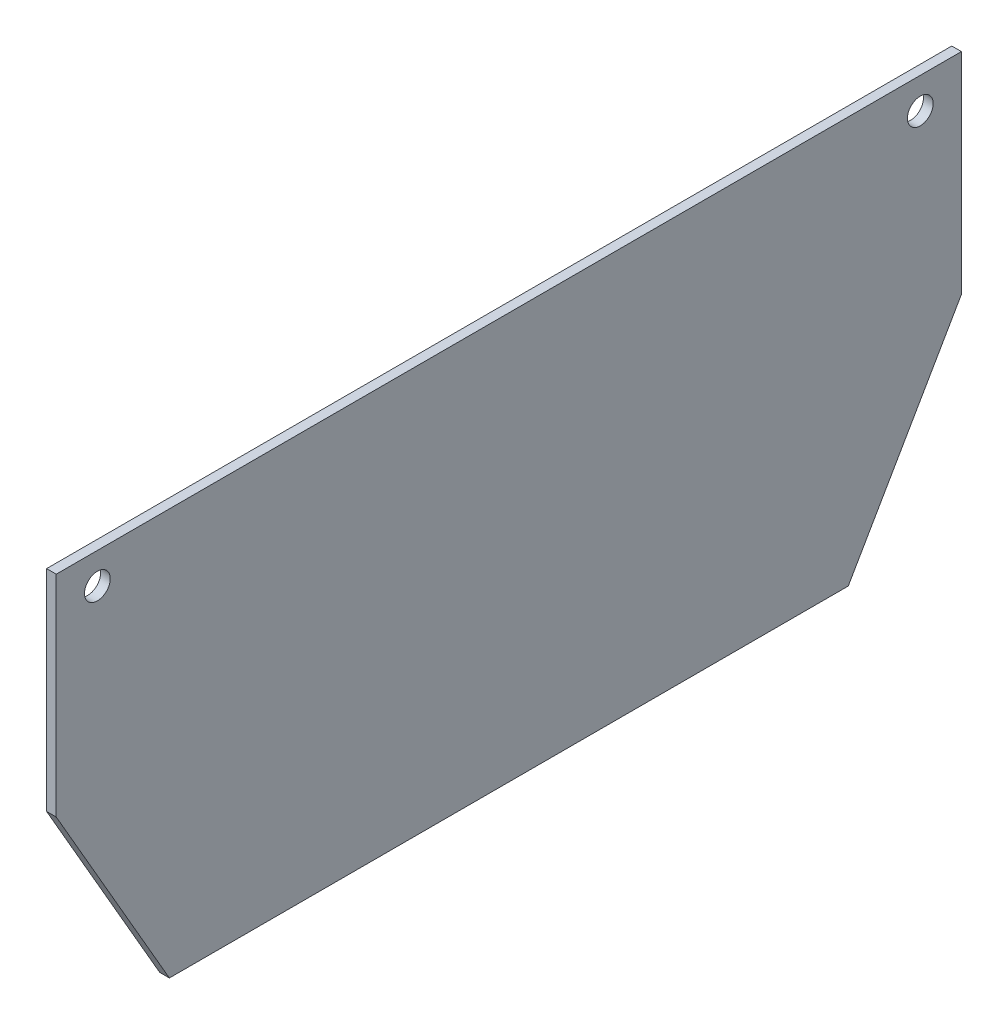
ISO-10303-21;
HEADER;
FILE_DESCRIPTION(('STEP AP214'),'2;1');
FILE_NAME('part.step','',(''),(''),'','','');
FILE_SCHEMA(('AUTOMOTIVE_DESIGN { 1 0 10303 214 1 1 1 1 }'));
ENDSEC;
DATA;
#1=APPLICATION_CONTEXT('core data for automotive mechanical design processes');
#2=APPLICATION_PROTOCOL_DEFINITION('international standard','automotive_design',2000,#1);
#3=PRODUCT_CONTEXT('',#1,'mechanical');
#4=PRODUCT('Part','Part','',(#3));
#5=PRODUCT_RELATED_PRODUCT_CATEGORY('part','',(#4));
#6=PRODUCT_DEFINITION_FORMATION('','',#4);
#7=PRODUCT_DEFINITION_CONTEXT('part definition',#1,'design');
#8=PRODUCT_DEFINITION('design','',#6,#7);
#9=PRODUCT_DEFINITION_SHAPE('','',#8);
#10=(LENGTH_UNIT() NAMED_UNIT(*) SI_UNIT(.MILLI.,.METRE.));
#11=(NAMED_UNIT(*) PLANE_ANGLE_UNIT() SI_UNIT($,.RADIAN.));
#12=(NAMED_UNIT(*) SI_UNIT($,.STERADIAN.) SOLID_ANGLE_UNIT());
#13=UNCERTAINTY_MEASURE_WITH_UNIT(LENGTH_MEASURE(1.E-05),#10,'distance_accuracy_value','');
#14=(GEOMETRIC_REPRESENTATION_CONTEXT(3) GLOBAL_UNCERTAINTY_ASSIGNED_CONTEXT((#13)) GLOBAL_UNIT_ASSIGNED_CONTEXT((#10,
#11,#12)) REPRESENTATION_CONTEXT('',''));
#15=CARTESIAN_POINT('',(0.,0.,0.));
#16=DIRECTION('',(0.,0.,1.));
#17=DIRECTION('',(1.,0.,0.));
#18=AXIS2_PLACEMENT_3D('',#15,#16,#17);
#19=CARTESIAN_POINT('',(11.90625,-250.825,-558.8));
#20=DIRECTION('',(0.,0.,1.));
#21=DIRECTION('',(1.,0.,0.));
#22=AXIS2_PLACEMENT_3D('',#19,#20,#21);
#23=PLANE('',#22);
#24=DIRECTION('',(0.,1.,0.));
#25=VECTOR('',#24,1.);
#26=CARTESIAN_POINT('',(11.90625,-250.825,-558.8));
#27=LINE('',#26,#25);
#28=CARTESIAN_POINT('',(11.90625,-8.85750218262826,-558.8));
#29=VERTEX_POINT('',#28);
#30=CARTESIAN_POINT('',(11.90625,250.825,-558.8));
#31=VERTEX_POINT('',#30);
#32=EDGE_CURVE('E98',#29,#31,#27,.T.);
#33=ORIENTED_EDGE('',*,*,#32,.F.);
#34=DIRECTION('',(-1.,0.,0.));
#35=VECTOR('',#34,1.);
#36=CARTESIAN_POINT('',(11.90625,-8.85750218262826,-558.8));
#37=LINE('',#36,#35);
#38=CARTESIAN_POINT('',(0.,-8.85750218262826,-558.8));
#39=VERTEX_POINT('',#38);
#40=EDGE_CURVE('E11',#29,#39,#37,.T.);
#41=ORIENTED_EDGE('',*,*,#40,.T.);
#42=DIRECTION('',(0.,1.,0.));
#43=VECTOR('',#42,1.);
#44=CARTESIAN_POINT('',(0.,-250.825,-558.8));
#45=LINE('',#44,#43);
#46=CARTESIAN_POINT('',(0.,250.825,-558.8));
#47=VERTEX_POINT('',#46);
#48=EDGE_CURVE('E119',#39,#47,#45,.T.);
#49=ORIENTED_EDGE('',*,*,#48,.T.);
#50=DIRECTION('',(-1.,0.,0.));
#51=VECTOR('',#50,1.);
#52=CARTESIAN_POINT('',(11.90625,250.825,-558.8));
#53=LINE('',#52,#51);
#54=EDGE_CURVE('E112',#31,#47,#53,.T.);
#55=ORIENTED_EDGE('',*,*,#54,.F.);
#56=EDGE_LOOP('',(#33,#41,#49,#55));
#57=FACE_BOUND('',#56,.T.);
#58=ADVANCED_FACE('F43',(#57),#23,.F.);
#59=CARTESIAN_POINT('',(11.90625,250.825,558.8));
#60=DIRECTION('',(0.,-1.,0.));
#61=DIRECTION('',(0.,0.,-1.));
#62=AXIS2_PLACEMENT_3D('',#59,#60,#61);
#63=PLANE('',#62);
#64=DIRECTION('',(0.,0.,1.));
#65=VECTOR('',#64,1.);
#66=CARTESIAN_POINT('',(0.,250.825,558.8));
#67=LINE('',#66,#65);
#68=CARTESIAN_POINT('',(0.,250.825,558.8));
#69=VERTEX_POINT('',#68);
#70=EDGE_CURVE('E165',#47,#69,#67,.T.);
#71=ORIENTED_EDGE('',*,*,#70,.T.);
#72=DIRECTION('',(-1.,0.,0.));
#73=VECTOR('',#72,1.);
#74=CARTESIAN_POINT('',(11.90625,250.825,558.8));
#75=LINE('',#74,#73);
#76=CARTESIAN_POINT('',(11.90625,250.825,558.8));
#77=VERTEX_POINT('',#76);
#78=EDGE_CURVE('E114',#77,#69,#75,.T.);
#79=ORIENTED_EDGE('',*,*,#78,.F.);
#80=DIRECTION('',(0.,0.,1.));
#81=VECTOR('',#80,1.);
#82=CARTESIAN_POINT('',(11.90625,250.825,558.8));
#83=LINE('',#82,#81);
#84=EDGE_CURVE('E101',#31,#77,#83,.T.);
#85=ORIENTED_EDGE('',*,*,#84,.F.);
#86=ORIENTED_EDGE('',*,*,#54,.T.);
#87=EDGE_LOOP('',(#71,#79,#85,#86));
#88=FACE_BOUND('',#87,.T.);
#89=ADVANCED_FACE('F111',(#88),#63,.F.);
#90=CARTESIAN_POINT('',(11.90625,-250.825,558.8));
#91=DIRECTION('',(0.,0.,-1.));
#92=DIRECTION('',(-1.,0.,0.));
#93=AXIS2_PLACEMENT_3D('',#90,#91,#92);
#94=PLANE('',#93);
#95=DIRECTION('',(0.,-1.,0.));
#96=VECTOR('',#95,1.);
#97=CARTESIAN_POINT('',(0.,-250.825,558.8));
#98=LINE('',#97,#96);
#99=CARTESIAN_POINT('',(0.,-8.85750218262826,558.8));
#100=VERTEX_POINT('',#99);
#101=EDGE_CURVE('E162',#69,#100,#98,.T.);
#102=ORIENTED_EDGE('',*,*,#101,.T.);
#103=DIRECTION('',(1.,0.,0.));
#104=VECTOR('',#103,1.);
#105=CARTESIAN_POINT('',(11.90625,-8.85750218262826,558.8));
#106=LINE('',#105,#104);
#107=CARTESIAN_POINT('',(11.90625,-8.85750218262826,558.8));
#108=VERTEX_POINT('',#107);
#109=EDGE_CURVE('E68',#100,#108,#106,.T.);
#110=ORIENTED_EDGE('',*,*,#109,.T.);
#111=DIRECTION('',(0.,-1.,0.));
#112=VECTOR('',#111,1.);
#113=CARTESIAN_POINT('',(11.90625,-250.825,558.8));
#114=LINE('',#113,#112);
#115=EDGE_CURVE('E116',#77,#108,#114,.T.);
#116=ORIENTED_EDGE('',*,*,#115,.F.);
#117=ORIENTED_EDGE('',*,*,#78,.T.);
#118=EDGE_LOOP('',(#102,#110,#116,#117));
#119=FACE_BOUND('',#118,.T.);
#120=ADVANCED_FACE('F163',(#119),#94,.F.);
#121=CARTESIAN_POINT('',(11.90625,-250.825,558.8));
#122=DIRECTION('',(0.,1.,0.));
#123=DIRECTION('',(0.,0.,1.));
#124=AXIS2_PLACEMENT_3D('',#121,#122,#123);
#125=PLANE('',#124);
#126=DIRECTION('',(0.,0.,-1.));
#127=VECTOR('',#126,1.);
#128=CARTESIAN_POINT('',(11.90625,-250.825,558.8));
#129=LINE('',#128,#127);
#130=CARTESIAN_POINT('',(11.90625,-250.825,419.1));
#131=VERTEX_POINT('',#130);
#132=CARTESIAN_POINT('',(11.90625,-250.825,-419.1));
#133=VERTEX_POINT('',#132);
#134=EDGE_CURVE('E129',#131,#133,#129,.T.);
#135=ORIENTED_EDGE('',*,*,#134,.F.);
#136=DIRECTION('',(-1.,0.,0.));
#137=VECTOR('',#136,1.);
#138=CARTESIAN_POINT('',(11.90625,-250.825,419.1));
#139=LINE('',#138,#137);
#140=CARTESIAN_POINT('',(0.,-250.825,419.1));
#141=VERTEX_POINT('',#140);
#142=EDGE_CURVE('E127',#131,#141,#139,.T.);
#143=ORIENTED_EDGE('',*,*,#142,.T.);
#144=DIRECTION('',(0.,0.,-1.));
#145=VECTOR('',#144,1.);
#146=CARTESIAN_POINT('',(0.,-250.825,558.8));
#147=LINE('',#146,#145);
#148=CARTESIAN_POINT('',(0.,-250.825,-419.1));
#149=VERTEX_POINT('',#148);
#150=EDGE_CURVE('E107',#141,#149,#147,.T.);
#151=ORIENTED_EDGE('',*,*,#150,.T.);
#152=DIRECTION('',(1.,0.,0.));
#153=VECTOR('',#152,1.);
#154=CARTESIAN_POINT('',(11.90625,-250.825,-419.1));
#155=LINE('',#154,#153);
#156=EDGE_CURVE('E122',#149,#133,#155,.T.);
#157=ORIENTED_EDGE('',*,*,#156,.T.);
#158=EDGE_LOOP('',(#135,#143,#151,#157));
#159=FACE_BOUND('',#158,.T.);
#160=ADVANCED_FACE('F152',(#159),#125,.F.);
#161=CARTESIAN_POINT('',(11.90625,0.,0.));
#162=DIRECTION('',(-1.,0.,0.));
#163=DIRECTION('',(0.,0.,1.));
#164=AXIS2_PLACEMENT_3D('',#161,#162,#163);
#165=PLANE('',#164);
#166=CARTESIAN_POINT('',(11.90625,212.725,508.));
#167=DIRECTION('',(1.,0.,0.));
#168=DIRECTION('',(0.,0.,-1.));
#169=AXIS2_PLACEMENT_3D('',#166,#167,#168);
#170=CIRCLE('',#169,15.875);
#171=CARTESIAN_POINT('',(11.90625,212.725,492.125));
#172=VERTEX_POINT('',#171);
#173=EDGE_CURVE('E185',#172,#172,#170,.T.);
#174=ORIENTED_EDGE('',*,*,#173,.F.);
#175=EDGE_LOOP('',(#174));
#176=FACE_BOUND('',#175,.T.);
#177=CARTESIAN_POINT('',(11.90625,212.725,-508.));
#178=DIRECTION('',(1.,0.,0.));
#179=DIRECTION('',(0.,0.,-1.));
#180=AXIS2_PLACEMENT_3D('',#177,#178,#179);
#181=CIRCLE('',#180,15.875);
#182=CARTESIAN_POINT('',(11.90625,212.725,-523.875));
#183=VERTEX_POINT('',#182);
#184=EDGE_CURVE('E177',#183,#183,#181,.T.);
#185=ORIENTED_EDGE('',*,*,#184,.F.);
#186=EDGE_LOOP('',(#185));
#187=FACE_BOUND('',#186,.T.);
#188=ORIENTED_EDGE('',*,*,#115,.T.);
#189=DIRECTION('',(0.,0.866025403784438,0.500000000000001));
#190=VECTOR('',#189,1.);
#191=CARTESIAN_POINT('',(11.90625,-250.825,419.1));
#192=LINE('',#191,#190);
#193=EDGE_CURVE('E53',#108,#131,#192,.F.);
#194=ORIENTED_EDGE('',*,*,#193,.T.);
#195=ORIENTED_EDGE('',*,*,#134,.T.);
#196=DIRECTION('',(0.,-0.866025403784438,0.500000000000001));
#197=VECTOR('',#196,1.);
#198=CARTESIAN_POINT('',(11.90625,-8.85750218262826,-558.8));
#199=LINE('',#198,#197);
#200=EDGE_CURVE('E60',#133,#29,#199,.F.);
#201=ORIENTED_EDGE('',*,*,#200,.T.);
#202=ORIENTED_EDGE('',*,*,#32,.T.);
#203=ORIENTED_EDGE('',*,*,#84,.T.);
#204=EDGE_LOOP('',(#188,#194,#195,#201,#202,#203));
#205=FACE_BOUND('',#204,.T.);
#206=ADVANCED_FACE('F100',(#176,#187,#205),#165,.F.);
#207=CARTESIAN_POINT('',(0.,0.,0.));
#208=DIRECTION('',(-1.,0.,0.));
#209=DIRECTION('',(0.,0.,1.));
#210=AXIS2_PLACEMENT_3D('',#207,#208,#209);
#211=PLANE('',#210);
#212=CARTESIAN_POINT('',(0.,212.725,508.));
#213=DIRECTION('',(1.,0.,0.));
#214=DIRECTION('',(0.,0.,-1.));
#215=AXIS2_PLACEMENT_3D('',#212,#213,#214);
#216=CIRCLE('',#215,15.875);
#217=CARTESIAN_POINT('',(0.,212.725,492.125));
#218=VERTEX_POINT('',#217);
#219=EDGE_CURVE('E173',#218,#218,#216,.T.);
#220=ORIENTED_EDGE('',*,*,#219,.T.);
#221=EDGE_LOOP('',(#220));
#222=FACE_BOUND('',#221,.T.);
#223=CARTESIAN_POINT('',(0.,212.725,-508.));
#224=DIRECTION('',(1.,0.,0.));
#225=DIRECTION('',(0.,0.,-1.));
#226=AXIS2_PLACEMENT_3D('',#223,#224,#225);
#227=CIRCLE('',#226,15.875);
#228=CARTESIAN_POINT('',(0.,212.725,-523.875));
#229=VERTEX_POINT('',#228);
#230=EDGE_CURVE('E181',#229,#229,#227,.T.);
#231=ORIENTED_EDGE('',*,*,#230,.T.);
#232=EDGE_LOOP('',(#231));
#233=FACE_BOUND('',#232,.T.);
#234=ORIENTED_EDGE('',*,*,#150,.F.);
#235=DIRECTION('',(0.,-0.866025403784438,-0.500000000000001));
#236=VECTOR('',#235,1.);
#237=CARTESIAN_POINT('',(0.,-244.18187336303,422.935410952115));
#238=LINE('',#237,#236);
#239=EDGE_CURVE('E139',#141,#100,#238,.F.);
#240=ORIENTED_EDGE('',*,*,#239,.T.);
#241=ORIENTED_EDGE('',*,*,#101,.F.);
#242=ORIENTED_EDGE('',*,*,#70,.F.);
#243=ORIENTED_EDGE('',*,*,#48,.F.);
#244=DIRECTION('',(0.,0.866025403784438,-0.500000000000001));
#245=VECTOR('',#244,1.);
#246=CARTESIAN_POINT('',(0.,-244.18187336303,-422.935410952116));
#247=LINE('',#246,#245);
#248=EDGE_CURVE('E136',#39,#149,#247,.F.);
#249=ORIENTED_EDGE('',*,*,#248,.T.);
#250=EDGE_LOOP('',(#234,#240,#241,#242,#243,#249));
#251=FACE_BOUND('',#250,.T.);
#252=ADVANCED_FACE('F161',(#222,#233,#251),#211,.T.);
#253=CARTESIAN_POINT('',(0.,212.725,-508.));
#254=DIRECTION('',(1.,0.,0.));
#255=DIRECTION('',(0.,0.,-1.));
#256=AXIS2_PLACEMENT_3D('',#253,#254,#255);
#257=CYLINDRICAL_SURFACE('',#256,15.875);
#258=ORIENTED_EDGE('',*,*,#230,.F.);
#259=EDGE_LOOP('',(#258));
#260=FACE_BOUND('',#259,.T.);
#261=ORIENTED_EDGE('',*,*,#184,.T.);
#262=EDGE_LOOP('',(#261));
#263=FACE_BOUND('',#262,.T.);
#264=ADVANCED_FACE('F199',(#260,#263),#257,.F.);
#265=CARTESIAN_POINT('',(0.,212.725,508.));
#266=DIRECTION('',(1.,0.,0.));
#267=DIRECTION('',(0.,0.,-1.));
#268=AXIS2_PLACEMENT_3D('',#265,#266,#267);
#269=CYLINDRICAL_SURFACE('',#268,15.875);
#270=ORIENTED_EDGE('',*,*,#219,.F.);
#271=EDGE_LOOP('',(#270));
#272=FACE_BOUND('',#271,.T.);
#273=ORIENTED_EDGE('',*,*,#173,.T.);
#274=EDGE_LOOP('',(#273));
#275=FACE_BOUND('',#274,.T.);
#276=ADVANCED_FACE('F196',(#272,#275),#269,.F.);
#277=CARTESIAN_POINT('',(11.90625,-250.825,419.1));
#278=DIRECTION('',(0.,0.500000000000001,-0.866025403784438));
#279=DIRECTION('',(-1.,0.,0.));
#280=AXIS2_PLACEMENT_3D('',#277,#278,#279);
#281=PLANE('',#280);
#282=ORIENTED_EDGE('',*,*,#193,.F.);
#283=ORIENTED_EDGE('',*,*,#109,.F.);
#284=ORIENTED_EDGE('',*,*,#239,.F.);
#285=ORIENTED_EDGE('',*,*,#142,.F.);
#286=EDGE_LOOP('',(#282,#283,#284,#285));
#287=FACE_BOUND('',#286,.T.);
#288=ADVANCED_FACE('F158',(#287),#281,.F.);
#289=CARTESIAN_POINT('',(11.90625,-8.85750218262826,-558.8));
#290=DIRECTION('',(0.,0.500000000000001,0.866025403784438));
#291=DIRECTION('',(-1.,0.,0.));
#292=AXIS2_PLACEMENT_3D('',#289,#290,#291);
#293=PLANE('',#292);
#294=ORIENTED_EDGE('',*,*,#200,.F.);
#295=ORIENTED_EDGE('',*,*,#156,.F.);
#296=ORIENTED_EDGE('',*,*,#248,.F.);
#297=ORIENTED_EDGE('',*,*,#40,.F.);
#298=EDGE_LOOP('',(#294,#295,#296,#297));
#299=FACE_BOUND('',#298,.T.);
#300=ADVANCED_FACE('F46',(#299),#293,.F.);
#301=CLOSED_SHELL('',(#58,#89,#120,#160,#206,#252,#264,#276,#288,#300));
#302=MANIFOLD_SOLID_BREP('B2',#301);
#303=ADVANCED_BREP_SHAPE_REPRESENTATION('',(#18,#302),#14);
#304=SHAPE_DEFINITION_REPRESENTATION(#9,#303);
ENDSEC;
END-ISO-10303-21;
